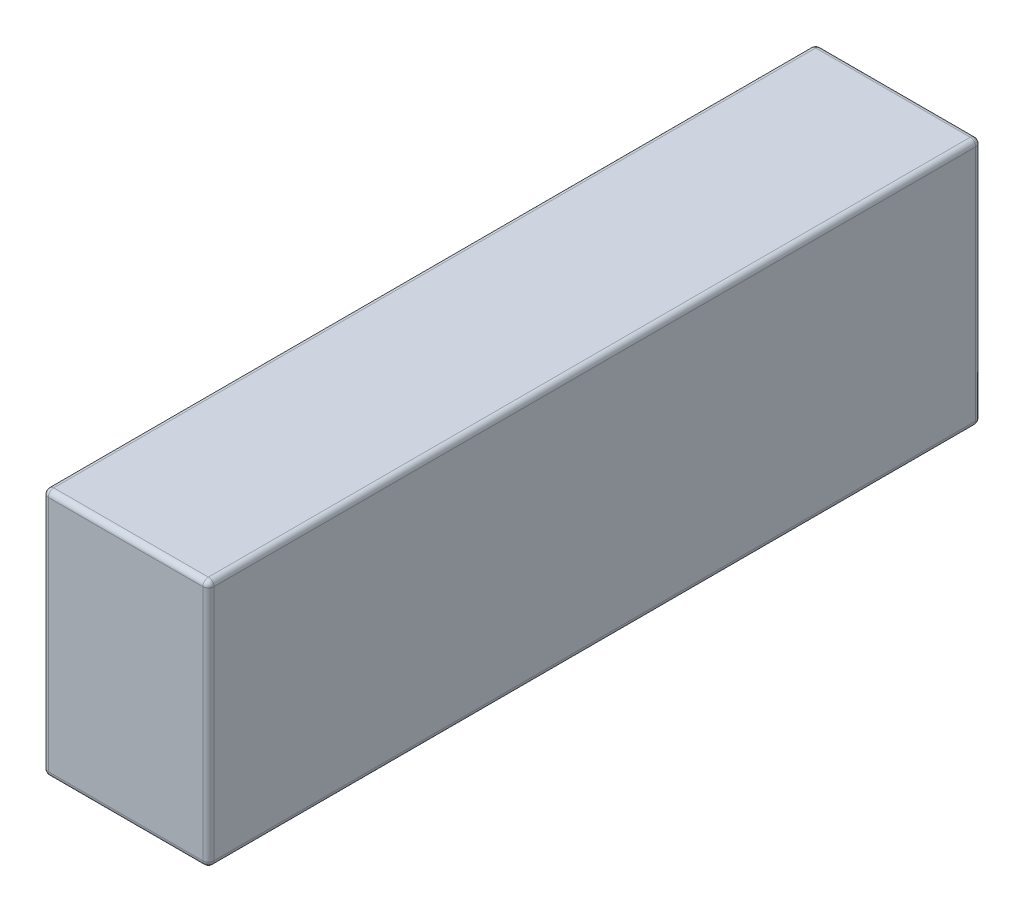
ISO-10303-21;
HEADER;
FILE_DESCRIPTION(('STEP AP214'),'2;1');
FILE_NAME('part.step','',(''),(''),'','','');
FILE_SCHEMA(('AUTOMOTIVE_DESIGN { 1 0 10303 214 1 1 1 1 }'));
ENDSEC;
DATA;
#1=APPLICATION_CONTEXT('core data for automotive mechanical design processes');
#2=APPLICATION_PROTOCOL_DEFINITION('international standard','automotive_design',2000,#1);
#3=PRODUCT_CONTEXT('',#1,'mechanical');
#4=PRODUCT('Part','Part','',(#3));
#5=PRODUCT_RELATED_PRODUCT_CATEGORY('part','',(#4));
#6=PRODUCT_DEFINITION_FORMATION('','',#4);
#7=PRODUCT_DEFINITION_CONTEXT('part definition',#1,'design');
#8=PRODUCT_DEFINITION('design','',#6,#7);
#9=PRODUCT_DEFINITION_SHAPE('','',#8);
#10=(LENGTH_UNIT() NAMED_UNIT(*) SI_UNIT(.MILLI.,.METRE.));
#11=(NAMED_UNIT(*) PLANE_ANGLE_UNIT() SI_UNIT($,.RADIAN.));
#12=(NAMED_UNIT(*) SI_UNIT($,.STERADIAN.) SOLID_ANGLE_UNIT());
#13=UNCERTAINTY_MEASURE_WITH_UNIT(LENGTH_MEASURE(1.E-05),#10,'distance_accuracy_value','');
#14=(GEOMETRIC_REPRESENTATION_CONTEXT(3) GLOBAL_UNCERTAINTY_ASSIGNED_CONTEXT((#13)) GLOBAL_UNIT_ASSIGNED_CONTEXT((#10,
#11,#12)) REPRESENTATION_CONTEXT('',''));
#15=CARTESIAN_POINT('',(0.,0.,0.));
#16=DIRECTION('',(0.,0.,1.));
#17=DIRECTION('',(1.,0.,0.));
#18=AXIS2_PLACEMENT_3D('',#15,#16,#17);
#19=CARTESIAN_POINT('',(-15.,45.,70.));
#20=DIRECTION('',(1.,0.,0.));
#21=DIRECTION('',(0.,0.,-1.));
#22=AXIS2_PLACEMENT_3D('',#19,#20,#21);
#23=PLANE('',#22);
#24=DIRECTION('',(0.,0.,1.));
#25=VECTOR('',#24,1.);
#26=CARTESIAN_POINT('',(-15.,44.,-70.));
#27=LINE('',#26,#25);
#28=CARTESIAN_POINT('',(-15.,44.,69.));
#29=VERTEX_POINT('',#28);
#30=CARTESIAN_POINT('',(-15.,44.,-69.));
#31=VERTEX_POINT('',#30);
#32=EDGE_CURVE('E177',#29,#31,#27,.F.);
#33=ORIENTED_EDGE('',*,*,#32,.T.);
#34=DIRECTION('',(0.,-1.,0.));
#35=VECTOR('',#34,1.);
#36=CARTESIAN_POINT('',(-15.,45.,-69.));
#37=LINE('',#36,#35);
#38=CARTESIAN_POINT('',(-15.,1.,-69.));
#39=VERTEX_POINT('',#38);
#40=EDGE_CURVE('E183',#31,#39,#37,.T.);
#41=ORIENTED_EDGE('',*,*,#40,.T.);
#42=DIRECTION('',(0.,0.,1.));
#43=VECTOR('',#42,1.);
#44=CARTESIAN_POINT('',(-15.,1.,70.));
#45=LINE('',#44,#43);
#46=CARTESIAN_POINT('',(-15.,1.,69.));
#47=VERTEX_POINT('',#46);
#48=EDGE_CURVE('E181',#39,#47,#45,.T.);
#49=ORIENTED_EDGE('',*,*,#48,.T.);
#50=DIRECTION('',(0.,-1.,0.));
#51=VECTOR('',#50,1.);
#52=CARTESIAN_POINT('',(-15.,45.,69.));
#53=LINE('',#52,#51);
#54=EDGE_CURVE('E179',#47,#29,#53,.F.);
#55=ORIENTED_EDGE('',*,*,#54,.T.);
#56=EDGE_LOOP('',(#33,#41,#49,#55));
#57=FACE_BOUND('',#56,.T.);
#58=ADVANCED_FACE('F37',(#57),#23,.F.);
#59=CARTESIAN_POINT('',(15.,45.,70.));
#60=DIRECTION('',(0.,0.,-1.));
#61=DIRECTION('',(-1.,0.,0.));
#62=AXIS2_PLACEMENT_3D('',#59,#60,#61);
#63=PLANE('',#62);
#64=DIRECTION('',(1.,0.,0.));
#65=VECTOR('',#64,1.);
#66=CARTESIAN_POINT('',(-15.,44.,70.));
#67=LINE('',#66,#65);
#68=CARTESIAN_POINT('',(14.,44.,70.));
#69=VERTEX_POINT('',#68);
#70=CARTESIAN_POINT('',(-14.,44.,70.));
#71=VERTEX_POINT('',#70);
#72=EDGE_CURVE('E188',#69,#71,#67,.F.);
#73=ORIENTED_EDGE('',*,*,#72,.T.);
#74=DIRECTION('',(0.,-1.,0.));
#75=VECTOR('',#74,1.);
#76=CARTESIAN_POINT('',(-14.,45.,70.));
#77=LINE('',#76,#75);
#78=CARTESIAN_POINT('',(-14.,1.,70.));
#79=VERTEX_POINT('',#78);
#80=EDGE_CURVE('E192',#71,#79,#77,.T.);
#81=ORIENTED_EDGE('',*,*,#80,.T.);
#82=DIRECTION('',(1.,0.,0.));
#83=VECTOR('',#82,1.);
#84=CARTESIAN_POINT('',(15.,1.,70.));
#85=LINE('',#84,#83);
#86=CARTESIAN_POINT('',(14.,1.,70.));
#87=VERTEX_POINT('',#86);
#88=EDGE_CURVE('E190',#79,#87,#85,.T.);
#89=ORIENTED_EDGE('',*,*,#88,.T.);
#90=DIRECTION('',(0.,-1.,0.));
#91=VECTOR('',#90,1.);
#92=CARTESIAN_POINT('',(14.,45.,70.));
#93=LINE('',#92,#91);
#94=EDGE_CURVE('E186',#87,#69,#93,.F.);
#95=ORIENTED_EDGE('',*,*,#94,.T.);
#96=EDGE_LOOP('',(#73,#81,#89,#95));
#97=FACE_BOUND('',#96,.T.);
#98=ADVANCED_FACE('F276',(#97),#63,.F.);
#99=CARTESIAN_POINT('',(15.,45.,70.));
#100=DIRECTION('',(-1.,0.,0.));
#101=DIRECTION('',(0.,0.,1.));
#102=AXIS2_PLACEMENT_3D('',#99,#100,#101);
#103=PLANE('',#102);
#104=DIRECTION('',(0.,0.,-1.));
#105=VECTOR('',#104,1.);
#106=CARTESIAN_POINT('',(15.,44.,70.));
#107=LINE('',#106,#105);
#108=CARTESIAN_POINT('',(15.,44.,-69.));
#109=VERTEX_POINT('',#108);
#110=CARTESIAN_POINT('',(15.,44.,69.));
#111=VERTEX_POINT('',#110);
#112=EDGE_CURVE('E46',#109,#111,#107,.F.);
#113=ORIENTED_EDGE('',*,*,#112,.T.);
#114=DIRECTION('',(0.,-1.,0.));
#115=VECTOR('',#114,1.);
#116=CARTESIAN_POINT('',(15.,45.,69.));
#117=LINE('',#116,#115);
#118=CARTESIAN_POINT('',(15.,1.,69.));
#119=VERTEX_POINT('',#118);
#120=EDGE_CURVE('E11',#111,#119,#117,.T.);
#121=ORIENTED_EDGE('',*,*,#120,.T.);
#122=DIRECTION('',(0.,0.,-1.));
#123=VECTOR('',#122,1.);
#124=CARTESIAN_POINT('',(15.,1.,70.));
#125=LINE('',#124,#123);
#126=CARTESIAN_POINT('',(15.,1.,-69.));
#127=VERTEX_POINT('',#126);
#128=EDGE_CURVE('E202',#119,#127,#125,.T.);
#129=ORIENTED_EDGE('',*,*,#128,.T.);
#130=DIRECTION('',(0.,-1.,0.));
#131=VECTOR('',#130,1.);
#132=CARTESIAN_POINT('',(15.,45.,-69.));
#133=LINE('',#132,#131);
#134=EDGE_CURVE('E57',#127,#109,#133,.F.);
#135=ORIENTED_EDGE('',*,*,#134,.T.);
#136=EDGE_LOOP('',(#113,#121,#129,#135));
#137=FACE_BOUND('',#136,.T.);
#138=ADVANCED_FACE('F289',(#137),#103,.F.);
#139=CARTESIAN_POINT('',(15.,45.,-70.));
#140=DIRECTION('',(0.,0.,1.));
#141=DIRECTION('',(1.,0.,0.));
#142=AXIS2_PLACEMENT_3D('',#139,#140,#141);
#143=PLANE('',#142);
#144=DIRECTION('',(0.,-1.,0.));
#145=VECTOR('',#144,1.);
#146=CARTESIAN_POINT('',(14.,45.,-70.));
#147=LINE('',#146,#145);
#148=CARTESIAN_POINT('',(14.,44.,-70.));
#149=VERTEX_POINT('',#148);
#150=CARTESIAN_POINT('',(14.,1.,-70.));
#151=VERTEX_POINT('',#150);
#152=EDGE_CURVE('E129',#149,#151,#147,.T.);
#153=ORIENTED_EDGE('',*,*,#152,.T.);
#154=DIRECTION('',(-1.,0.,0.));
#155=VECTOR('',#154,1.);
#156=CARTESIAN_POINT('',(15.,1.,-70.));
#157=LINE('',#156,#155);
#158=CARTESIAN_POINT('',(-14.,1.,-70.));
#159=VERTEX_POINT('',#158);
#160=EDGE_CURVE('E166',#151,#159,#157,.T.);
#161=ORIENTED_EDGE('',*,*,#160,.T.);
#162=DIRECTION('',(0.,-1.,0.));
#163=VECTOR('',#162,1.);
#164=CARTESIAN_POINT('',(-14.,45.,-70.));
#165=LINE('',#164,#163);
#166=CARTESIAN_POINT('',(-14.,44.,-70.));
#167=VERTEX_POINT('',#166);
#168=EDGE_CURVE('E132',#159,#167,#165,.F.);
#169=ORIENTED_EDGE('',*,*,#168,.T.);
#170=DIRECTION('',(-1.,0.,0.));
#171=VECTOR('',#170,1.);
#172=CARTESIAN_POINT('',(15.,44.,-70.));
#173=LINE('',#172,#171);
#174=EDGE_CURVE('E124',#167,#149,#173,.F.);
#175=ORIENTED_EDGE('',*,*,#174,.T.);
#176=EDGE_LOOP('',(#153,#161,#169,#175));
#177=FACE_BOUND('',#176,.T.);
#178=ADVANCED_FACE('F126',(#177),#143,.F.);
#179=CARTESIAN_POINT('',(0.,45.,0.));
#180=DIRECTION('',(0.,1.,0.));
#181=DIRECTION('',(0.,0.,1.));
#182=AXIS2_PLACEMENT_3D('',#179,#180,#181);
#183=PLANE('',#182);
#184=DIRECTION('',(-1.,0.,0.));
#185=VECTOR('',#184,1.);
#186=CARTESIAN_POINT('',(-15.,45.,-69.));
#187=LINE('',#186,#185);
#188=CARTESIAN_POINT('',(14.,45.,-69.));
#189=VERTEX_POINT('',#188);
#190=CARTESIAN_POINT('',(-14.,45.,-69.));
#191=VERTEX_POINT('',#190);
#192=EDGE_CURVE('E143',#189,#191,#187,.T.);
#193=ORIENTED_EDGE('',*,*,#192,.T.);
#194=DIRECTION('',(0.,0.,1.));
#195=VECTOR('',#194,1.);
#196=CARTESIAN_POINT('',(-14.,45.,70.));
#197=LINE('',#196,#195);
#198=CARTESIAN_POINT('',(-14.,45.,69.));
#199=VERTEX_POINT('',#198);
#200=EDGE_CURVE('E200',#191,#199,#197,.T.);
#201=ORIENTED_EDGE('',*,*,#200,.T.);
#202=DIRECTION('',(1.,0.,0.));
#203=VECTOR('',#202,1.);
#204=CARTESIAN_POINT('',(15.,45.,69.));
#205=LINE('',#204,#203);
#206=CARTESIAN_POINT('',(14.,45.,69.));
#207=VERTEX_POINT('',#206);
#208=EDGE_CURVE('E197',#199,#207,#205,.T.);
#209=ORIENTED_EDGE('',*,*,#208,.T.);
#210=DIRECTION('',(0.,0.,-1.));
#211=VECTOR('',#210,1.);
#212=CARTESIAN_POINT('',(14.,45.,-70.));
#213=LINE('',#212,#211);
#214=EDGE_CURVE('E195',#207,#189,#213,.T.);
#215=ORIENTED_EDGE('',*,*,#214,.T.);
#216=EDGE_LOOP('',(#193,#201,#209,#215));
#217=FACE_BOUND('',#216,.T.);
#218=ADVANCED_FACE('F481',(#217),#183,.T.);
#219=CARTESIAN_POINT('',(0.,0.,0.));
#220=DIRECTION('',(0.,1.,0.));
#221=DIRECTION('',(0.,0.,1.));
#222=AXIS2_PLACEMENT_3D('',#219,#220,#221);
#223=PLANE('',#222);
#224=DIRECTION('',(0.,0.,1.));
#225=VECTOR('',#224,1.);
#226=CARTESIAN_POINT('',(-14.,0.,0.));
#227=LINE('',#226,#225);
#228=CARTESIAN_POINT('',(-14.,0.,69.));
#229=VERTEX_POINT('',#228);
#230=CARTESIAN_POINT('',(-14.,0.,-69.));
#231=VERTEX_POINT('',#230);
#232=EDGE_CURVE('E172',#229,#231,#227,.F.);
#233=ORIENTED_EDGE('',*,*,#232,.T.);
#234=DIRECTION('',(-1.,0.,0.));
#235=VECTOR('',#234,1.);
#236=CARTESIAN_POINT('',(0.,0.,-69.));
#237=LINE('',#236,#235);
#238=CARTESIAN_POINT('',(14.,0.,-69.));
#239=VERTEX_POINT('',#238);
#240=EDGE_CURVE('E174',#231,#239,#237,.F.);
#241=ORIENTED_EDGE('',*,*,#240,.T.);
#242=DIRECTION('',(0.,0.,-1.));
#243=VECTOR('',#242,1.);
#244=CARTESIAN_POINT('',(14.,0.,0.));
#245=LINE('',#244,#243);
#246=CARTESIAN_POINT('',(14.,0.,69.));
#247=VERTEX_POINT('',#246);
#248=EDGE_CURVE('E168',#239,#247,#245,.F.);
#249=ORIENTED_EDGE('',*,*,#248,.T.);
#250=DIRECTION('',(1.,0.,0.));
#251=VECTOR('',#250,1.);
#252=CARTESIAN_POINT('',(0.,0.,69.));
#253=LINE('',#252,#251);
#254=EDGE_CURVE('E170',#247,#229,#253,.F.);
#255=ORIENTED_EDGE('',*,*,#254,.T.);
#256=EDGE_LOOP('',(#233,#241,#249,#255));
#257=FACE_BOUND('',#256,.T.);
#258=ADVANCED_FACE('F474',(#257),#223,.F.);
#259=CARTESIAN_POINT('',(0.,44.,69.));
#260=DIRECTION('',(-1.,0.,0.));
#261=DIRECTION('',(0.,0.,1.));
#262=AXIS2_PLACEMENT_3D('',#259,#260,#261);
#263=CYLINDRICAL_SURFACE('',#262,1.);
#264=CARTESIAN_POINT('',(14.,44.,69.));
#265=DIRECTION('',(1.,0.,0.));
#266=DIRECTION('',(0.,0.,-1.));
#267=AXIS2_PLACEMENT_3D('',#264,#265,#266);
#268=CIRCLE('',#267,1.);
#269=EDGE_CURVE('E41',#207,#69,#268,.T.);
#270=ORIENTED_EDGE('',*,*,#269,.F.);
#271=ORIENTED_EDGE('',*,*,#208,.F.);
#272=CARTESIAN_POINT('',(-14.,44.,69.));
#273=DIRECTION('',(-1.,0.,0.));
#274=DIRECTION('',(0.,-1.,0.));
#275=AXIS2_PLACEMENT_3D('',#272,#273,#274);
#276=CIRCLE('',#275,1.);
#277=EDGE_CURVE('E163',#71,#199,#276,.T.);
#278=ORIENTED_EDGE('',*,*,#277,.F.);
#279=ORIENTED_EDGE('',*,*,#72,.F.);
#280=EDGE_LOOP('',(#270,#271,#278,#279));
#281=FACE_BOUND('',#280,.T.);
#282=ADVANCED_FACE('F39',(#281),#263,.T.);
#283=CARTESIAN_POINT('',(14.,44.,69.));
#284=DIRECTION('',(0.,0.,1.));
#285=DIRECTION('',(1.,0.,0.));
#286=AXIS2_PLACEMENT_3D('',#283,#284,#285);
#287=SPHERICAL_SURFACE('',#286,1.);
#288=CARTESIAN_POINT('',(14.,44.,69.));
#289=DIRECTION('',(0.,0.,1.));
#290=DIRECTION('',(1.,0.,0.));
#291=AXIS2_PLACEMENT_3D('',#288,#289,#290);
#292=CIRCLE('',#291,1.);
#293=EDGE_CURVE('E247',#207,#111,#292,.F.);
#294=ORIENTED_EDGE('',*,*,#293,.F.);
#295=ORIENTED_EDGE('',*,*,#269,.T.);
#296=CARTESIAN_POINT('',(14.,44.,69.));
#297=DIRECTION('',(0.,1.,0.));
#298=DIRECTION('',(0.,0.,1.));
#299=AXIS2_PLACEMENT_3D('',#296,#297,#298);
#300=CIRCLE('',#299,1.);
#301=EDGE_CURVE('E249',#111,#69,#300,.F.);
#302=ORIENTED_EDGE('',*,*,#301,.F.);
#303=EDGE_LOOP('',(#294,#295,#302));
#304=FACE_BOUND('',#303,.T.);
#305=ADVANCED_FACE('F282',(#304),#287,.T.);
#306=CARTESIAN_POINT('',(-14.,44.,69.));
#307=DIRECTION('',(0.,0.,1.));
#308=DIRECTION('',(1.,0.,0.));
#309=AXIS2_PLACEMENT_3D('',#306,#307,#308);
#310=SPHERICAL_SURFACE('',#309,1.);
#311=CARTESIAN_POINT('',(-14.,44.,69.));
#312=DIRECTION('',(0.,1.,0.));
#313=DIRECTION('',(0.,0.,1.));
#314=AXIS2_PLACEMENT_3D('',#311,#312,#313);
#315=CIRCLE('',#314,1.);
#316=EDGE_CURVE('E241',#71,#29,#315,.F.);
#317=ORIENTED_EDGE('',*,*,#316,.F.);
#318=ORIENTED_EDGE('',*,*,#277,.T.);
#319=CARTESIAN_POINT('',(-14.,44.,69.));
#320=DIRECTION('',(0.,0.,1.));
#321=DIRECTION('',(1.,0.,0.));
#322=AXIS2_PLACEMENT_3D('',#319,#320,#321);
#323=CIRCLE('',#322,1.);
#324=EDGE_CURVE('E244',#29,#199,#323,.F.);
#325=ORIENTED_EDGE('',*,*,#324,.F.);
#326=EDGE_LOOP('',(#317,#318,#325));
#327=FACE_BOUND('',#326,.T.);
#328=ADVANCED_FACE('F256',(#327),#310,.T.);
#329=CARTESIAN_POINT('',(14.,45.,69.));
#330=DIRECTION('',(0.,-1.,0.));
#331=DIRECTION('',(0.,0.,-1.));
#332=AXIS2_PLACEMENT_3D('',#329,#330,#331);
#333=CYLINDRICAL_SURFACE('',#332,1.);
#334=ORIENTED_EDGE('',*,*,#301,.T.);
#335=ORIENTED_EDGE('',*,*,#94,.F.);
#336=CARTESIAN_POINT('',(14.,1.,69.));
#337=DIRECTION('',(0.,-1.,0.));
#338=DIRECTION('',(0.,0.,-1.));
#339=AXIS2_PLACEMENT_3D('',#336,#337,#338);
#340=CIRCLE('',#339,1.);
#341=EDGE_CURVE('E235',#119,#87,#340,.T.);
#342=ORIENTED_EDGE('',*,*,#341,.F.);
#343=ORIENTED_EDGE('',*,*,#120,.F.);
#344=EDGE_LOOP('',(#334,#335,#342,#343));
#345=FACE_BOUND('',#344,.T.);
#346=ADVANCED_FACE('F286',(#345),#333,.T.);
#347=CARTESIAN_POINT('',(14.,44.,0.));
#348=DIRECTION('',(0.,0.,1.));
#349=DIRECTION('',(1.,0.,0.));
#350=AXIS2_PLACEMENT_3D('',#347,#348,#349);
#351=CYLINDRICAL_SURFACE('',#350,1.);
#352=ORIENTED_EDGE('',*,*,#293,.T.);
#353=ORIENTED_EDGE('',*,*,#112,.F.);
#354=CARTESIAN_POINT('',(14.,44.,-69.));
#355=DIRECTION('',(0.,0.,-1.));
#356=DIRECTION('',(-1.,0.,0.));
#357=AXIS2_PLACEMENT_3D('',#354,#355,#356);
#358=CIRCLE('',#357,1.);
#359=EDGE_CURVE('E147',#189,#109,#358,.T.);
#360=ORIENTED_EDGE('',*,*,#359,.F.);
#361=ORIENTED_EDGE('',*,*,#214,.F.);
#362=EDGE_LOOP('',(#352,#353,#360,#361));
#363=FACE_BOUND('',#362,.T.);
#364=ADVANCED_FACE('F438',(#363),#351,.T.);
#365=CARTESIAN_POINT('',(0.,44.,-69.));
#366=DIRECTION('',(1.,0.,0.));
#367=DIRECTION('',(0.,0.,-1.));
#368=AXIS2_PLACEMENT_3D('',#365,#366,#367);
#369=CYLINDRICAL_SURFACE('',#368,1.);
#370=CARTESIAN_POINT('',(-14.,44.,-69.));
#371=DIRECTION('',(-1.,0.,0.));
#372=DIRECTION('',(0.,0.,1.));
#373=AXIS2_PLACEMENT_3D('',#370,#371,#372);
#374=CIRCLE('',#373,1.);
#375=EDGE_CURVE('E148',#191,#167,#374,.T.);
#376=ORIENTED_EDGE('',*,*,#375,.F.);
#377=ORIENTED_EDGE('',*,*,#192,.F.);
#378=CARTESIAN_POINT('',(14.,44.,-69.));
#379=DIRECTION('',(1.,0.,0.));
#380=DIRECTION('',(0.,0.,-1.));
#381=AXIS2_PLACEMENT_3D('',#378,#379,#380);
#382=CIRCLE('',#381,1.);
#383=EDGE_CURVE('E139',#149,#189,#382,.T.);
#384=ORIENTED_EDGE('',*,*,#383,.F.);
#385=ORIENTED_EDGE('',*,*,#174,.F.);
#386=EDGE_LOOP('',(#376,#377,#384,#385));
#387=FACE_BOUND('',#386,.T.);
#388=ADVANCED_FACE('F141',(#387),#369,.T.);
#389=CARTESIAN_POINT('',(-14.,44.,0.));
#390=DIRECTION('',(0.,0.,-1.));
#391=DIRECTION('',(-1.,0.,0.));
#392=AXIS2_PLACEMENT_3D('',#389,#390,#391);
#393=CYLINDRICAL_SURFACE('',#392,1.);
#394=ORIENTED_EDGE('',*,*,#324,.T.);
#395=ORIENTED_EDGE('',*,*,#200,.F.);
#396=CARTESIAN_POINT('',(-14.,44.,-69.));
#397=DIRECTION('',(0.,0.,-1.));
#398=DIRECTION('',(0.,1.,0.));
#399=AXIS2_PLACEMENT_3D('',#396,#397,#398);
#400=CIRCLE('',#399,1.);
#401=EDGE_CURVE('E231',#31,#191,#400,.T.);
#402=ORIENTED_EDGE('',*,*,#401,.F.);
#403=ORIENTED_EDGE('',*,*,#32,.F.);
#404=EDGE_LOOP('',(#394,#395,#402,#403));
#405=FACE_BOUND('',#404,.T.);
#406=ADVANCED_FACE('F264',(#405),#393,.T.);
#407=CARTESIAN_POINT('',(-14.,45.,69.));
#408=DIRECTION('',(0.,-1.,0.));
#409=DIRECTION('',(0.,0.,-1.));
#410=AXIS2_PLACEMENT_3D('',#407,#408,#409);
#411=CYLINDRICAL_SURFACE('',#410,1.);
#412=ORIENTED_EDGE('',*,*,#316,.T.);
#413=ORIENTED_EDGE('',*,*,#54,.F.);
#414=CARTESIAN_POINT('',(-14.,1.,69.));
#415=DIRECTION('',(0.,-1.,0.));
#416=DIRECTION('',(0.,0.,-1.));
#417=AXIS2_PLACEMENT_3D('',#414,#415,#416);
#418=CIRCLE('',#417,1.);
#419=EDGE_CURVE('E228',#79,#47,#418,.T.);
#420=ORIENTED_EDGE('',*,*,#419,.F.);
#421=ORIENTED_EDGE('',*,*,#80,.F.);
#422=EDGE_LOOP('',(#412,#413,#420,#421));
#423=FACE_BOUND('',#422,.T.);
#424=ADVANCED_FACE('F273',(#423),#411,.T.);
#425=CARTESIAN_POINT('',(15.,1.,69.));
#426=DIRECTION('',(1.,0.,0.));
#427=DIRECTION('',(0.,0.,-1.));
#428=AXIS2_PLACEMENT_3D('',#425,#426,#427);
#429=CYLINDRICAL_SURFACE('',#428,1.);
#430=CARTESIAN_POINT('',(14.,1.,69.));
#431=DIRECTION('',(1.,0.,0.));
#432=DIRECTION('',(0.,0.,-1.));
#433=AXIS2_PLACEMENT_3D('',#430,#431,#432);
#434=CIRCLE('',#433,1.);
#435=EDGE_CURVE('E238',#87,#247,#434,.T.);
#436=ORIENTED_EDGE('',*,*,#435,.F.);
#437=ORIENTED_EDGE('',*,*,#88,.F.);
#438=CARTESIAN_POINT('',(-14.,1.,69.));
#439=DIRECTION('',(-1.,0.,0.));
#440=DIRECTION('',(0.,0.,1.));
#441=AXIS2_PLACEMENT_3D('',#438,#439,#440);
#442=CIRCLE('',#441,1.);
#443=EDGE_CURVE('E226',#229,#79,#442,.T.);
#444=ORIENTED_EDGE('',*,*,#443,.F.);
#445=ORIENTED_EDGE('',*,*,#254,.F.);
#446=EDGE_LOOP('',(#436,#437,#444,#445));
#447=FACE_BOUND('',#446,.T.);
#448=ADVANCED_FACE('F407',(#447),#429,.T.);
#449=CARTESIAN_POINT('',(14.,1.,69.));
#450=DIRECTION('',(0.,0.,1.));
#451=DIRECTION('',(1.,0.,0.));
#452=AXIS2_PLACEMENT_3D('',#449,#450,#451);
#453=SPHERICAL_SURFACE('',#452,1.);
#454=ORIENTED_EDGE('',*,*,#341,.T.);
#455=ORIENTED_EDGE('',*,*,#435,.T.);
#456=CARTESIAN_POINT('',(14.,1.,69.));
#457=DIRECTION('',(0.,0.,1.));
#458=DIRECTION('',(1.,0.,0.));
#459=AXIS2_PLACEMENT_3D('',#456,#457,#458);
#460=CIRCLE('',#459,1.);
#461=EDGE_CURVE('E154',#119,#247,#460,.F.);
#462=ORIENTED_EDGE('',*,*,#461,.F.);
#463=EDGE_LOOP('',(#454,#455,#462));
#464=FACE_BOUND('',#463,.T.);
#465=ADVANCED_FACE('F319',(#464),#453,.T.);
#466=CARTESIAN_POINT('',(14.,44.,-69.));
#467=DIRECTION('',(0.,0.,1.));
#468=DIRECTION('',(1.,0.,0.));
#469=AXIS2_PLACEMENT_3D('',#466,#467,#468);
#470=SPHERICAL_SURFACE('',#469,1.);
#471=ORIENTED_EDGE('',*,*,#383,.T.);
#472=ORIENTED_EDGE('',*,*,#359,.T.);
#473=CARTESIAN_POINT('',(14.,44.,-69.));
#474=DIRECTION('',(0.,1.,0.));
#475=DIRECTION('',(0.,0.,1.));
#476=AXIS2_PLACEMENT_3D('',#473,#474,#475);
#477=CIRCLE('',#476,1.);
#478=EDGE_CURVE('E151',#149,#109,#477,.F.);
#479=ORIENTED_EDGE('',*,*,#478,.F.);
#480=EDGE_LOOP('',(#471,#472,#479));
#481=FACE_BOUND('',#480,.T.);
#482=ADVANCED_FACE('F152',(#481),#470,.T.);
#483=CARTESIAN_POINT('',(-14.,44.,-69.));
#484=DIRECTION('',(0.,0.,1.));
#485=DIRECTION('',(1.,0.,0.));
#486=AXIS2_PLACEMENT_3D('',#483,#484,#485);
#487=SPHERICAL_SURFACE('',#486,1.);
#488=ORIENTED_EDGE('',*,*,#401,.T.);
#489=ORIENTED_EDGE('',*,*,#375,.T.);
#490=CARTESIAN_POINT('',(-14.,44.,-69.));
#491=DIRECTION('',(0.,1.,0.));
#492=DIRECTION('',(0.,0.,1.));
#493=AXIS2_PLACEMENT_3D('',#490,#491,#492);
#494=CIRCLE('',#493,1.);
#495=EDGE_CURVE('E155',#31,#167,#494,.F.);
#496=ORIENTED_EDGE('',*,*,#495,.F.);
#497=EDGE_LOOP('',(#488,#489,#496));
#498=FACE_BOUND('',#497,.T.);
#499=ADVANCED_FACE('F309',(#498),#487,.T.);
#500=CARTESIAN_POINT('',(-14.,1.,69.));
#501=DIRECTION('',(0.,0.,1.));
#502=DIRECTION('',(1.,0.,0.));
#503=AXIS2_PLACEMENT_3D('',#500,#501,#502);
#504=SPHERICAL_SURFACE('',#503,1.);
#505=ORIENTED_EDGE('',*,*,#443,.T.);
#506=ORIENTED_EDGE('',*,*,#419,.T.);
#507=CARTESIAN_POINT('',(-14.,1.,69.));
#508=DIRECTION('',(0.,0.,1.));
#509=DIRECTION('',(1.,0.,0.));
#510=AXIS2_PLACEMENT_3D('',#507,#508,#509);
#511=CIRCLE('',#510,1.);
#512=EDGE_CURVE('E219',#229,#47,#511,.F.);
#513=ORIENTED_EDGE('',*,*,#512,.F.);
#514=EDGE_LOOP('',(#505,#506,#513));
#515=FACE_BOUND('',#514,.T.);
#516=ADVANCED_FACE('F311',(#515),#504,.T.);
#517=CARTESIAN_POINT('',(14.,1.,70.));
#518=DIRECTION('',(0.,0.,-1.));
#519=DIRECTION('',(-1.,0.,0.));
#520=AXIS2_PLACEMENT_3D('',#517,#518,#519);
#521=CYLINDRICAL_SURFACE('',#520,1.);
#522=ORIENTED_EDGE('',*,*,#461,.T.);
#523=ORIENTED_EDGE('',*,*,#248,.F.);
#524=CARTESIAN_POINT('',(14.,1.,-69.));
#525=DIRECTION('',(0.,0.,-1.));
#526=DIRECTION('',(-1.,0.,0.));
#527=AXIS2_PLACEMENT_3D('',#524,#525,#526);
#528=CIRCLE('',#527,1.);
#529=EDGE_CURVE('E216',#127,#239,#528,.T.);
#530=ORIENTED_EDGE('',*,*,#529,.F.);
#531=ORIENTED_EDGE('',*,*,#128,.F.);
#532=EDGE_LOOP('',(#522,#523,#530,#531));
#533=FACE_BOUND('',#532,.T.);
#534=ADVANCED_FACE('F294',(#533),#521,.T.);
#535=CARTESIAN_POINT('',(14.,45.,-69.));
#536=DIRECTION('',(0.,-1.,0.));
#537=DIRECTION('',(0.,0.,-1.));
#538=AXIS2_PLACEMENT_3D('',#535,#536,#537);
#539=CYLINDRICAL_SURFACE('',#538,1.);
#540=ORIENTED_EDGE('',*,*,#478,.T.);
#541=ORIENTED_EDGE('',*,*,#134,.F.);
#542=CARTESIAN_POINT('',(14.,1.,-69.));
#543=DIRECTION('',(0.,-1.,0.));
#544=DIRECTION('',(0.,0.,-1.));
#545=AXIS2_PLACEMENT_3D('',#542,#543,#544);
#546=CIRCLE('',#545,1.);
#547=EDGE_CURVE('E159',#151,#127,#546,.T.);
#548=ORIENTED_EDGE('',*,*,#547,.F.);
#549=ORIENTED_EDGE('',*,*,#152,.F.);
#550=EDGE_LOOP('',(#540,#541,#548,#549));
#551=FACE_BOUND('',#550,.T.);
#552=ADVANCED_FACE('F157',(#551),#539,.T.);
#553=CARTESIAN_POINT('',(-14.,45.,-69.));
#554=DIRECTION('',(0.,-1.,0.));
#555=DIRECTION('',(0.,0.,-1.));
#556=AXIS2_PLACEMENT_3D('',#553,#554,#555);
#557=CYLINDRICAL_SURFACE('',#556,1.);
#558=ORIENTED_EDGE('',*,*,#495,.T.);
#559=ORIENTED_EDGE('',*,*,#168,.F.);
#560=CARTESIAN_POINT('',(-14.,1.,-69.));
#561=DIRECTION('',(0.,-1.,0.));
#562=DIRECTION('',(0.,0.,-1.));
#563=AXIS2_PLACEMENT_3D('',#560,#561,#562);
#564=CIRCLE('',#563,1.);
#565=EDGE_CURVE('E212',#39,#159,#564,.T.);
#566=ORIENTED_EDGE('',*,*,#565,.F.);
#567=ORIENTED_EDGE('',*,*,#40,.F.);
#568=EDGE_LOOP('',(#558,#559,#566,#567));
#569=FACE_BOUND('',#568,.T.);
#570=ADVANCED_FACE('F307',(#569),#557,.T.);
#571=CARTESIAN_POINT('',(-14.,1.,70.));
#572=DIRECTION('',(0.,0.,1.));
#573=DIRECTION('',(1.,0.,0.));
#574=AXIS2_PLACEMENT_3D('',#571,#572,#573);
#575=CYLINDRICAL_SURFACE('',#574,1.);
#576=ORIENTED_EDGE('',*,*,#512,.T.);
#577=ORIENTED_EDGE('',*,*,#48,.F.);
#578=CARTESIAN_POINT('',(-14.,1.,-69.));
#579=DIRECTION('',(0.,0.,-1.));
#580=DIRECTION('',(-1.,0.,0.));
#581=AXIS2_PLACEMENT_3D('',#578,#579,#580);
#582=CIRCLE('',#581,1.);
#583=EDGE_CURVE('E210',#231,#39,#582,.T.);
#584=ORIENTED_EDGE('',*,*,#583,.F.);
#585=ORIENTED_EDGE('',*,*,#232,.F.);
#586=EDGE_LOOP('',(#576,#577,#584,#585));
#587=FACE_BOUND('',#586,.T.);
#588=ADVANCED_FACE('F335',(#587),#575,.T.);
#589=CARTESIAN_POINT('',(14.,1.,-69.));
#590=DIRECTION('',(0.,0.,1.));
#591=DIRECTION('',(1.,0.,0.));
#592=AXIS2_PLACEMENT_3D('',#589,#590,#591);
#593=SPHERICAL_SURFACE('',#592,1.);
#594=ORIENTED_EDGE('',*,*,#547,.T.);
#595=ORIENTED_EDGE('',*,*,#529,.T.);
#596=CARTESIAN_POINT('',(14.,1.,-69.));
#597=DIRECTION('',(1.,0.,0.));
#598=DIRECTION('',(0.,0.,-1.));
#599=AXIS2_PLACEMENT_3D('',#596,#597,#598);
#600=CIRCLE('',#599,1.);
#601=EDGE_CURVE('E208',#151,#239,#600,.F.);
#602=ORIENTED_EDGE('',*,*,#601,.F.);
#603=EDGE_LOOP('',(#594,#595,#602));
#604=FACE_BOUND('',#603,.T.);
#605=ADVANCED_FACE('F296',(#604),#593,.T.);
#606=CARTESIAN_POINT('',(-14.,1.,-69.));
#607=DIRECTION('',(0.,0.,1.));
#608=DIRECTION('',(1.,0.,0.));
#609=AXIS2_PLACEMENT_3D('',#606,#607,#608);
#610=SPHERICAL_SURFACE('',#609,1.);
#611=ORIENTED_EDGE('',*,*,#583,.T.);
#612=ORIENTED_EDGE('',*,*,#565,.T.);
#613=CARTESIAN_POINT('',(-14.,1.,-69.));
#614=DIRECTION('',(-1.,0.,0.));
#615=DIRECTION('',(0.,0.,1.));
#616=AXIS2_PLACEMENT_3D('',#613,#614,#615);
#617=CIRCLE('',#616,1.);
#618=EDGE_CURVE('E206',#231,#159,#617,.F.);
#619=ORIENTED_EDGE('',*,*,#618,.F.);
#620=EDGE_LOOP('',(#611,#612,#619));
#621=FACE_BOUND('',#620,.T.);
#622=ADVANCED_FACE('F304',(#621),#610,.T.);
#623=CARTESIAN_POINT('',(15.,1.,-69.));
#624=DIRECTION('',(-1.,0.,0.));
#625=DIRECTION('',(0.,0.,1.));
#626=AXIS2_PLACEMENT_3D('',#623,#624,#625);
#627=CYLINDRICAL_SURFACE('',#626,1.);
#628=ORIENTED_EDGE('',*,*,#601,.T.);
#629=ORIENTED_EDGE('',*,*,#240,.F.);
#630=ORIENTED_EDGE('',*,*,#618,.T.);
#631=ORIENTED_EDGE('',*,*,#160,.F.);
#632=EDGE_LOOP('',(#628,#629,#630,#631));
#633=FACE_BOUND('',#632,.T.);
#634=ADVANCED_FACE('F300',(#633),#627,.T.);
#635=CLOSED_SHELL('',(#58,#98,#138,#178,#218,#258,#282,#305,#328,#346,#364,#388,#406,#424,#448,
#465,#482,#499,#516,#534,#552,#570,#588,#605,#622,#634));
#636=MANIFOLD_SOLID_BREP('B2',#635);
#637=ADVANCED_BREP_SHAPE_REPRESENTATION('',(#18,#636),#14);
#638=SHAPE_DEFINITION_REPRESENTATION(#9,#637);
ENDSEC;
END-ISO-10303-21;
